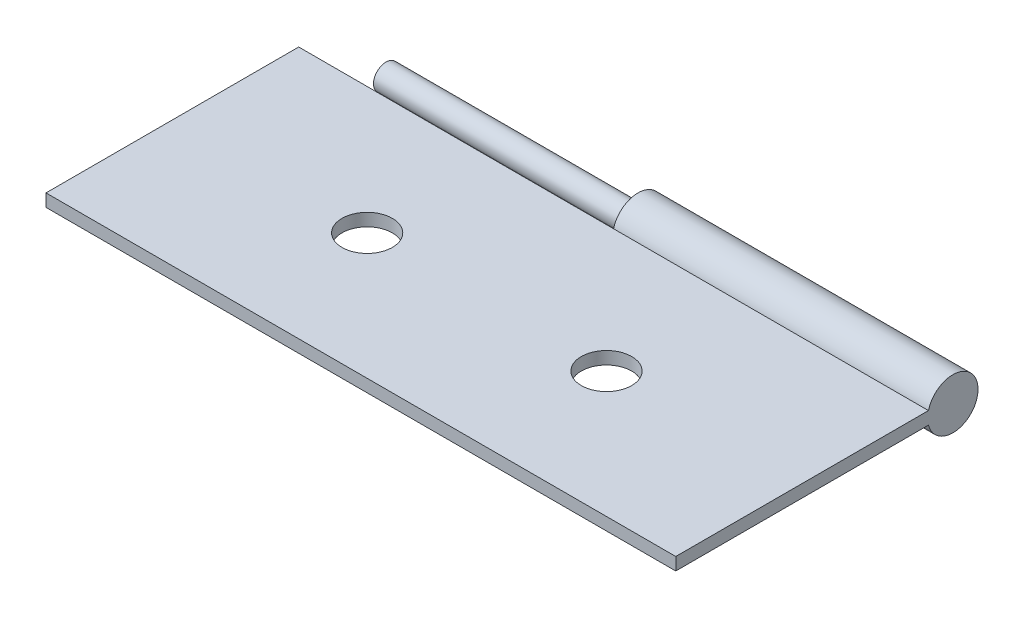
ISO-10303-21;
HEADER;
FILE_DESCRIPTION(('STEP AP214'),'2;1');
FILE_NAME('part.step','',(''),(''),'','','');
FILE_SCHEMA(('AUTOMOTIVE_DESIGN { 1 0 10303 214 1 1 1 1 }'));
ENDSEC;
DATA;
#1=APPLICATION_CONTEXT('core data for automotive mechanical design processes');
#2=APPLICATION_PROTOCOL_DEFINITION('international standard','automotive_design',2000,#1);
#3=PRODUCT_CONTEXT('',#1,'mechanical');
#4=PRODUCT('Part','Part','',(#3));
#5=PRODUCT_RELATED_PRODUCT_CATEGORY('part','',(#4));
#6=PRODUCT_DEFINITION_FORMATION('','',#4);
#7=PRODUCT_DEFINITION_CONTEXT('part definition',#1,'design');
#8=PRODUCT_DEFINITION('design','',#6,#7);
#9=PRODUCT_DEFINITION_SHAPE('','',#8);
#10=(LENGTH_UNIT() NAMED_UNIT(*) SI_UNIT(.MILLI.,.METRE.));
#11=(NAMED_UNIT(*) PLANE_ANGLE_UNIT() SI_UNIT($,.RADIAN.));
#12=(NAMED_UNIT(*) SI_UNIT($,.STERADIAN.) SOLID_ANGLE_UNIT());
#13=UNCERTAINTY_MEASURE_WITH_UNIT(LENGTH_MEASURE(1.E-05),#10,'distance_accuracy_value','');
#14=(GEOMETRIC_REPRESENTATION_CONTEXT(3) GLOBAL_UNCERTAINTY_ASSIGNED_CONTEXT((#13)) GLOBAL_UNIT_ASSIGNED_CONTEXT((#10,
#11,#12)) REPRESENTATION_CONTEXT('',''));
#15=CARTESIAN_POINT('',(0.,0.,0.));
#16=DIRECTION('',(0.,0.,1.));
#17=DIRECTION('',(1.,0.,0.));
#18=AXIS2_PLACEMENT_3D('',#15,#16,#17);
#19=CARTESIAN_POINT('',(0.,0.,-12.));
#20=DIRECTION('',(1.,0.,0.));
#21=DIRECTION('',(0.,0.,-1.));
#22=AXIS2_PLACEMENT_3D('',#19,#20,#21);
#23=CYLINDRICAL_SURFACE('',#22,2.);
#24=CARTESIAN_POINT('',(25.,0.,-12.));
#25=DIRECTION('',(1.,0.,0.));
#26=DIRECTION('',(0.,0.,-1.));
#27=AXIS2_PLACEMENT_3D('',#24,#25,#26);
#28=CIRCLE('',#27,2.);
#29=CARTESIAN_POINT('',(25.,-0.5,-10.0635083268963));
#30=VERTEX_POINT('',#29);
#31=CARTESIAN_POINT('',(25.,0.5,-10.0635083268963));
#32=VERTEX_POINT('',#31);
#33=EDGE_CURVE('E108',#30,#32,#28,.T.);
#34=ORIENTED_EDGE('',*,*,#33,.F.);
#35=DIRECTION('',(1.,0.,0.));
#36=VECTOR('',#35,1.);
#37=CARTESIAN_POINT('',(0.,-0.5,-10.0635083268963));
#38=LINE('',#37,#36);
#39=CARTESIAN_POINT('',(0.,-0.5,-10.0635083268963));
#40=VERTEX_POINT('',#39);
#41=EDGE_CURVE('E85',#40,#30,#38,.T.);
#42=ORIENTED_EDGE('',*,*,#41,.F.);
#43=CARTESIAN_POINT('',(0.,0.,-12.));
#44=DIRECTION('',(1.,0.,0.));
#45=DIRECTION('',(0.,0.,-1.));
#46=AXIS2_PLACEMENT_3D('',#43,#44,#45);
#47=CIRCLE('',#46,2.);
#48=CARTESIAN_POINT('',(0.,0.5,-10.0635083268963));
#49=VERTEX_POINT('',#48);
#50=EDGE_CURVE('E109',#40,#49,#47,.T.);
#51=ORIENTED_EDGE('',*,*,#50,.T.);
#52=DIRECTION('',(1.,0.,0.));
#53=VECTOR('',#52,1.);
#54=CARTESIAN_POINT('',(0.,0.5,-10.0635083268963));
#55=LINE('',#54,#53);
#56=EDGE_CURVE('E118',#32,#49,#55,.F.);
#57=ORIENTED_EDGE('',*,*,#56,.F.);
#58=EDGE_LOOP('',(#34,#42,#51,#57));
#59=FACE_BOUND('',#58,.T.);
#60=ADVANCED_FACE('F32',(#59),#23,.T.);
#61=CARTESIAN_POINT('',(0.,0.,-12.));
#62=DIRECTION('',(1.,0.,0.));
#63=DIRECTION('',(0.,0.,-1.));
#64=AXIS2_PLACEMENT_3D('',#61,#62,#63);
#65=CYLINDRICAL_SURFACE('',#64,2.);
#66=CARTESIAN_POINT('',(-25.,0.5,-10.0635083268963));
#67=VERTEX_POINT('',#66);
#68=EDGE_CURVE('E121',#49,#67,#55,.F.);
#69=ORIENTED_EDGE('',*,*,#68,.F.);
#70=EDGE_CURVE('E112',#49,#40,#47,.T.);
#71=ORIENTED_EDGE('',*,*,#70,.T.);
#72=CARTESIAN_POINT('',(-25.,-0.5,-10.0635083268963));
#73=VERTEX_POINT('',#72);
#74=EDGE_CURVE('E95',#73,#40,#38,.T.);
#75=ORIENTED_EDGE('',*,*,#74,.F.);
#76=CARTESIAN_POINT('',(-25.,0.,-12.));
#77=DIRECTION('',(1.,0.,0.));
#78=DIRECTION('',(0.,0.,-1.));
#79=AXIS2_PLACEMENT_3D('',#76,#77,#78);
#80=CIRCLE('',#79,2.);
#81=EDGE_CURVE('E117',#67,#73,#80,.T.);
#82=ORIENTED_EDGE('',*,*,#81,.F.);
#83=EDGE_LOOP('',(#69,#71,#75,#82));
#84=FACE_BOUND('',#83,.T.);
#85=ADVANCED_FACE('F135',(#84),#65,.F.);
#86=CARTESIAN_POINT('',(-25.,0.5,-9.99999999999999));
#87=DIRECTION('',(1.,0.,0.));
#88=DIRECTION('',(0.,0.,-1.));
#89=AXIS2_PLACEMENT_3D('',#86,#87,#88);
#90=PLANE('',#89);
#91=DIRECTION('',(0.,0.,1.));
#92=VECTOR('',#91,1.);
#93=CARTESIAN_POINT('',(-25.,-0.5,-9.99999999999999));
#94=LINE('',#93,#92);
#95=CARTESIAN_POINT('',(-25.,-0.5,10.));
#96=VERTEX_POINT('',#95);
#97=EDGE_CURVE('E76',#73,#96,#94,.T.);
#98=ORIENTED_EDGE('',*,*,#97,.T.);
#99=DIRECTION('',(0.,-1.,0.));
#100=VECTOR('',#99,1.);
#101=CARTESIAN_POINT('',(-25.,0.5,10.));
#102=LINE('',#101,#100);
#103=CARTESIAN_POINT('',(-25.,0.5,10.));
#104=VERTEX_POINT('',#103);
#105=EDGE_CURVE('E11',#104,#96,#102,.T.);
#106=ORIENTED_EDGE('',*,*,#105,.F.);
#107=DIRECTION('',(0.,0.,1.));
#108=VECTOR('',#107,1.);
#109=CARTESIAN_POINT('',(-25.,0.5,-9.99999999999999));
#110=LINE('',#109,#108);
#111=EDGE_CURVE('E86',#67,#104,#110,.T.);
#112=ORIENTED_EDGE('',*,*,#111,.F.);
#113=ORIENTED_EDGE('',*,*,#81,.T.);
#114=EDGE_LOOP('',(#98,#106,#112,#113));
#115=FACE_BOUND('',#114,.T.);
#116=ADVANCED_FACE('F34',(#115),#90,.F.);
#117=CARTESIAN_POINT('',(25.,0.5,10.));
#118=DIRECTION('',(0.,0.,-1.));
#119=DIRECTION('',(-1.,0.,0.));
#120=AXIS2_PLACEMENT_3D('',#117,#118,#119);
#121=PLANE('',#120);
#122=DIRECTION('',(1.,0.,0.));
#123=VECTOR('',#122,1.);
#124=CARTESIAN_POINT('',(25.,-0.5,10.));
#125=LINE('',#124,#123);
#126=CARTESIAN_POINT('',(25.,-0.5,10.));
#127=VERTEX_POINT('',#126);
#128=EDGE_CURVE('E69',#96,#127,#125,.T.);
#129=ORIENTED_EDGE('',*,*,#128,.T.);
#130=DIRECTION('',(0.,-1.,0.));
#131=VECTOR('',#130,1.);
#132=CARTESIAN_POINT('',(25.,0.5,10.));
#133=LINE('',#132,#131);
#134=CARTESIAN_POINT('',(25.,0.5,10.));
#135=VERTEX_POINT('',#134);
#136=EDGE_CURVE('E41',#135,#127,#133,.T.);
#137=ORIENTED_EDGE('',*,*,#136,.F.);
#138=DIRECTION('',(1.,0.,0.));
#139=VECTOR('',#138,1.);
#140=CARTESIAN_POINT('',(25.,0.5,10.));
#141=LINE('',#140,#139);
#142=EDGE_CURVE('E58',#104,#135,#141,.T.);
#143=ORIENTED_EDGE('',*,*,#142,.F.);
#144=ORIENTED_EDGE('',*,*,#105,.T.);
#145=EDGE_LOOP('',(#129,#137,#143,#144));
#146=FACE_BOUND('',#145,.T.);
#147=ADVANCED_FACE('F70',(#146),#121,.F.);
#148=CARTESIAN_POINT('',(25.,0.5,-10.));
#149=DIRECTION('',(-1.,0.,0.));
#150=DIRECTION('',(0.,0.,1.));
#151=AXIS2_PLACEMENT_3D('',#148,#149,#150);
#152=PLANE('',#151);
#153=DIRECTION('',(0.,0.,-1.));
#154=VECTOR('',#153,1.);
#155=CARTESIAN_POINT('',(25.,-0.5,-10.));
#156=LINE('',#155,#154);
#157=EDGE_CURVE('E49',#127,#30,#156,.T.);
#158=ORIENTED_EDGE('',*,*,#157,.T.);
#159=ORIENTED_EDGE('',*,*,#33,.T.);
#160=DIRECTION('',(0.,0.,-1.));
#161=VECTOR('',#160,1.);
#162=CARTESIAN_POINT('',(25.,0.5,-10.));
#163=LINE('',#162,#161);
#164=EDGE_CURVE('E79',#135,#32,#163,.T.);
#165=ORIENTED_EDGE('',*,*,#164,.F.);
#166=ORIENTED_EDGE('',*,*,#136,.T.);
#167=EDGE_LOOP('',(#158,#159,#165,#166));
#168=FACE_BOUND('',#167,.T.);
#169=ADVANCED_FACE('F78',(#168),#152,.F.);
#170=CARTESIAN_POINT('',(-25.,0.5,10.));
#171=DIRECTION('',(0.,-1.,0.));
#172=DIRECTION('',(0.,0.,-1.));
#173=AXIS2_PLACEMENT_3D('',#170,#171,#172);
#174=PLANE('',#173);
#175=CARTESIAN_POINT('',(-9.5,0.5,0.));
#176=DIRECTION('',(0.,1.,0.));
#177=DIRECTION('',(0.,0.,-1.));
#178=AXIS2_PLACEMENT_3D('',#175,#176,#177);
#179=CIRCLE('',#178,2.);
#180=CARTESIAN_POINT('',(-9.5,0.5,-2.));
#181=VERTEX_POINT('',#180);
#182=EDGE_CURVE('E102',#181,#181,#179,.T.);
#183=ORIENTED_EDGE('',*,*,#182,.F.);
#184=EDGE_LOOP('',(#183));
#185=FACE_BOUND('',#184,.T.);
#186=CARTESIAN_POINT('',(9.5,0.5,0.));
#187=DIRECTION('',(0.,1.,0.));
#188=DIRECTION('',(0.,0.,1.));
#189=AXIS2_PLACEMENT_3D('',#186,#187,#188);
#190=CIRCLE('',#189,2.);
#191=CARTESIAN_POINT('',(9.5,0.5,2.));
#192=VERTEX_POINT('',#191);
#193=EDGE_CURVE('E92',#192,#192,#190,.T.);
#194=ORIENTED_EDGE('',*,*,#193,.F.);
#195=EDGE_LOOP('',(#194));
#196=FACE_BOUND('',#195,.T.);
#197=ORIENTED_EDGE('',*,*,#111,.T.);
#198=ORIENTED_EDGE('',*,*,#142,.T.);
#199=ORIENTED_EDGE('',*,*,#164,.T.);
#200=ORIENTED_EDGE('',*,*,#56,.T.);
#201=ORIENTED_EDGE('',*,*,#68,.T.);
#202=EDGE_LOOP('',(#197,#198,#199,#200,#201));
#203=FACE_BOUND('',#202,.T.);
#204=ADVANCED_FACE('F149',(#185,#196,#203),#174,.F.);
#205=CARTESIAN_POINT('',(-25.,-0.5,10.));
#206=DIRECTION('',(0.,-1.,0.));
#207=DIRECTION('',(0.,0.,-1.));
#208=AXIS2_PLACEMENT_3D('',#205,#206,#207);
#209=PLANE('',#208);
#210=CARTESIAN_POINT('',(-9.5,-0.5,0.));
#211=DIRECTION('',(0.,-1.,0.));
#212=DIRECTION('',(0.,0.,-1.));
#213=AXIS2_PLACEMENT_3D('',#210,#211,#212);
#214=CIRCLE('',#213,2.);
#215=CARTESIAN_POINT('',(-9.5,-0.5,-2.));
#216=VERTEX_POINT('',#215);
#217=EDGE_CURVE('E36',#216,#216,#214,.T.);
#218=ORIENTED_EDGE('',*,*,#217,.F.);
#219=EDGE_LOOP('',(#218));
#220=FACE_BOUND('',#219,.T.);
#221=CARTESIAN_POINT('',(9.5,-0.5,0.));
#222=DIRECTION('',(0.,-1.,0.));
#223=DIRECTION('',(0.,0.,-1.));
#224=AXIS2_PLACEMENT_3D('',#221,#222,#223);
#225=CIRCLE('',#224,2.);
#226=CARTESIAN_POINT('',(9.5,-0.5,-2.));
#227=VERTEX_POINT('',#226);
#228=EDGE_CURVE('E90',#227,#227,#225,.T.);
#229=ORIENTED_EDGE('',*,*,#228,.F.);
#230=EDGE_LOOP('',(#229));
#231=FACE_BOUND('',#230,.T.);
#232=ORIENTED_EDGE('',*,*,#97,.F.);
#233=ORIENTED_EDGE('',*,*,#74,.T.);
#234=ORIENTED_EDGE('',*,*,#41,.T.);
#235=ORIENTED_EDGE('',*,*,#157,.F.);
#236=ORIENTED_EDGE('',*,*,#128,.F.);
#237=EDGE_LOOP('',(#232,#233,#234,#235,#236));
#238=FACE_BOUND('',#237,.T.);
#239=ADVANCED_FACE('F82',(#220,#231,#238),#209,.T.);
#240=CARTESIAN_POINT('',(0.,0.,-12.));
#241=DIRECTION('',(1.,0.,0.));
#242=DIRECTION('',(0.,0.,-1.));
#243=AXIS2_PLACEMENT_3D('',#240,#241,#242);
#244=PLANE('',#243);
#245=ORIENTED_EDGE('',*,*,#70,.F.);
#246=ORIENTED_EDGE('',*,*,#50,.F.);
#247=EDGE_LOOP('',(#245,#246));
#248=FACE_BOUND('',#247,.T.);
#249=CARTESIAN_POINT('',(0.,0.,-12.));
#250=DIRECTION('',(1.,0.,0.));
#251=DIRECTION('',(0.,0.,-1.));
#252=AXIS2_PLACEMENT_3D('',#249,#250,#251);
#253=CIRCLE('',#252,1.);
#254=CARTESIAN_POINT('',(0.,0.,-13.));
#255=VERTEX_POINT('',#254);
#256=EDGE_CURVE('E114',#255,#255,#253,.F.);
#257=ORIENTED_EDGE('',*,*,#256,.F.);
#258=EDGE_LOOP('',(#257));
#259=FACE_BOUND('',#258,.T.);
#260=ADVANCED_FACE('F142',(#248,#259),#244,.F.);
#261=CARTESIAN_POINT('',(-20.,0.,-12.));
#262=DIRECTION('',(1.,0.,0.));
#263=DIRECTION('',(0.,0.,-1.));
#264=AXIS2_PLACEMENT_3D('',#261,#262,#263);
#265=CYLINDRICAL_SURFACE('',#264,1.);
#266=CARTESIAN_POINT('',(-20.,0.,-12.));
#267=DIRECTION('',(-1.,0.,0.));
#268=DIRECTION('',(0.,0.,1.));
#269=AXIS2_PLACEMENT_3D('',#266,#267,#268);
#270=CIRCLE('',#269,1.);
#271=CARTESIAN_POINT('',(-20.,0.,-11.));
#272=VERTEX_POINT('',#271);
#273=EDGE_CURVE('E105',#272,#272,#270,.T.);
#274=ORIENTED_EDGE('',*,*,#273,.F.);
#275=EDGE_LOOP('',(#274));
#276=FACE_BOUND('',#275,.T.);
#277=ORIENTED_EDGE('',*,*,#256,.T.);
#278=EDGE_LOOP('',(#277));
#279=FACE_BOUND('',#278,.T.);
#280=ADVANCED_FACE('F171',(#276,#279),#265,.T.);
#281=CARTESIAN_POINT('',(-20.,0.,-12.));
#282=DIRECTION('',(-1.,0.,0.));
#283=DIRECTION('',(0.,0.,1.));
#284=AXIS2_PLACEMENT_3D('',#281,#282,#283);
#285=PLANE('',#284);
#286=ORIENTED_EDGE('',*,*,#273,.T.);
#287=EDGE_LOOP('',(#286));
#288=FACE_BOUND('',#287,.T.);
#289=ADVANCED_FACE('F174',(#288),#285,.T.);
#290=CARTESIAN_POINT('',(9.5,-2.,0.));
#291=DIRECTION('',(0.,1.,0.));
#292=DIRECTION('',(0.,0.,1.));
#293=AXIS2_PLACEMENT_3D('',#290,#291,#292);
#294=CYLINDRICAL_SURFACE('',#293,2.);
#295=ORIENTED_EDGE('',*,*,#228,.T.);
#296=EDGE_LOOP('',(#295));
#297=FACE_BOUND('',#296,.T.);
#298=ORIENTED_EDGE('',*,*,#193,.T.);
#299=EDGE_LOOP('',(#298));
#300=FACE_BOUND('',#299,.T.);
#301=ADVANCED_FACE('F178',(#297,#300),#294,.F.);
#302=CARTESIAN_POINT('',(-9.5,-2.,0.));
#303=DIRECTION('',(0.,1.,0.));
#304=DIRECTION('',(0.,0.,1.));
#305=AXIS2_PLACEMENT_3D('',#302,#303,#304);
#306=CYLINDRICAL_SURFACE('',#305,2.);
#307=ORIENTED_EDGE('',*,*,#217,.T.);
#308=EDGE_LOOP('',(#307));
#309=FACE_BOUND('',#308,.T.);
#310=ORIENTED_EDGE('',*,*,#182,.T.);
#311=EDGE_LOOP('',(#310));
#312=FACE_BOUND('',#311,.T.);
#313=ADVANCED_FACE('F182',(#309,#312),#306,.F.);
#314=CLOSED_SHELL('',(#60,#85,#116,#147,#169,#204,#239,#260,#280,#289,#301,#313));
#315=MANIFOLD_SOLID_BREP('B2',#314);
#316=ADVANCED_BREP_SHAPE_REPRESENTATION('',(#18,#315),#14);
#317=SHAPE_DEFINITION_REPRESENTATION(#9,#316);
ENDSEC;
END-ISO-10303-21;
